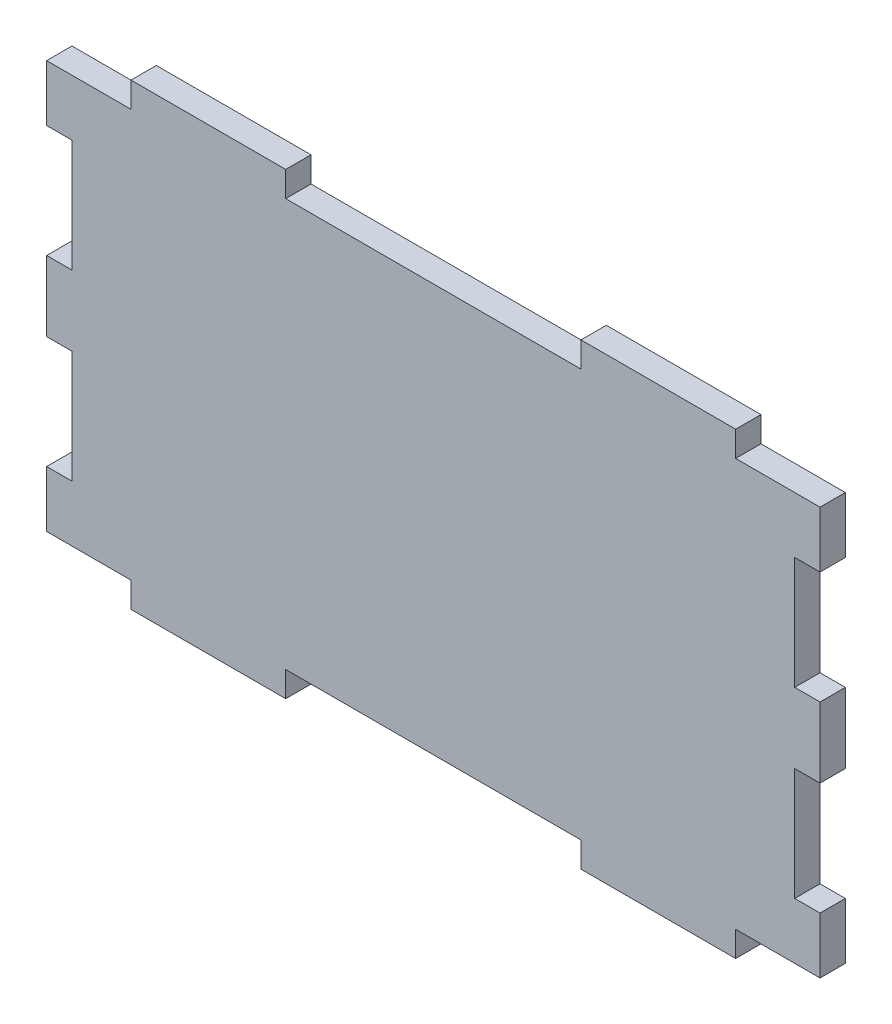
ISO-10303-21;
HEADER;
FILE_DESCRIPTION(('STEP AP214'),'2;1');
FILE_NAME('part.step','',(''),(''),'','','');
FILE_SCHEMA(('AUTOMOTIVE_DESIGN { 1 0 10303 214 1 1 1 1 }'));
ENDSEC;
DATA;
#1=APPLICATION_CONTEXT('core data for automotive mechanical design processes');
#2=APPLICATION_PROTOCOL_DEFINITION('international standard','automotive_design',2000,#1);
#3=PRODUCT_CONTEXT('',#1,'mechanical');
#4=PRODUCT('Part','Part','',(#3));
#5=PRODUCT_RELATED_PRODUCT_CATEGORY('part','',(#4));
#6=PRODUCT_DEFINITION_FORMATION('','',#4);
#7=PRODUCT_DEFINITION_CONTEXT('part definition',#1,'design');
#8=PRODUCT_DEFINITION('design','',#6,#7);
#9=PRODUCT_DEFINITION_SHAPE('','',#8);
#10=(LENGTH_UNIT() NAMED_UNIT(*) SI_UNIT(.MILLI.,.METRE.));
#11=(NAMED_UNIT(*) PLANE_ANGLE_UNIT() SI_UNIT($,.RADIAN.));
#12=(NAMED_UNIT(*) SI_UNIT($,.STERADIAN.) SOLID_ANGLE_UNIT());
#13=UNCERTAINTY_MEASURE_WITH_UNIT(LENGTH_MEASURE(1.E-05),#10,'distance_accuracy_value','');
#14=(GEOMETRIC_REPRESENTATION_CONTEXT(3) GLOBAL_UNCERTAINTY_ASSIGNED_CONTEXT((#13)) GLOBAL_UNIT_ASSIGNED_CONTEXT((#10,
#11,#12)) REPRESENTATION_CONTEXT('',''));
#15=CARTESIAN_POINT('',(0.,0.,0.));
#16=DIRECTION('',(0.,0.,1.));
#17=DIRECTION('',(1.,0.,0.));
#18=AXIS2_PLACEMENT_3D('',#15,#16,#17);
#19=CARTESIAN_POINT('',(0.,0.,-3.6));
#20=DIRECTION('',(0.,-1.,0.));
#21=DIRECTION('',(0.,0.,-1.));
#22=AXIS2_PLACEMENT_3D('',#19,#20,#21);
#23=PLANE('',#22);
#24=DIRECTION('',(0.,0.,1.));
#25=VECTOR('',#24,1.);
#26=CARTESIAN_POINT('',(98.,0.,-25.8925996689484));
#27=LINE('',#26,#25);
#28=CARTESIAN_POINT('',(98.,0.,-3.6));
#29=VERTEX_POINT('',#28);
#30=CARTESIAN_POINT('',(98.,0.,0.));
#31=VERTEX_POINT('',#30);
#32=EDGE_CURVE('E284',#29,#31,#27,.T.);
#33=ORIENTED_EDGE('',*,*,#32,.F.);
#34=DIRECTION('',(1.,0.,0.));
#35=VECTOR('',#34,1.);
#36=CARTESIAN_POINT('',(0.,0.,-3.6));
#37=LINE('',#36,#35);
#38=CARTESIAN_POINT('',(110.,0.,-3.6));
#39=VERTEX_POINT('',#38);
#40=EDGE_CURVE('E281',#29,#39,#37,.T.);
#41=ORIENTED_EDGE('',*,*,#40,.T.);
#42=DIRECTION('',(0.,0.,1.));
#43=VECTOR('',#42,1.);
#44=CARTESIAN_POINT('',(110.,0.,-3.6));
#45=LINE('',#44,#43);
#46=CARTESIAN_POINT('',(110.,0.,0.));
#47=VERTEX_POINT('',#46);
#48=EDGE_CURVE('E521',#39,#47,#45,.T.);
#49=ORIENTED_EDGE('',*,*,#48,.T.);
#50=DIRECTION('',(1.,0.,0.));
#51=VECTOR('',#50,1.);
#52=CARTESIAN_POINT('',(0.,0.,0.));
#53=LINE('',#52,#51);
#54=EDGE_CURVE('E504',#31,#47,#53,.T.);
#55=ORIENTED_EDGE('',*,*,#54,.F.);
#56=EDGE_LOOP('',(#33,#41,#49,#55));
#57=FACE_BOUND('',#56,.T.);
#58=ADVANCED_FACE('F37',(#57),#23,.T.);
#59=CARTESIAN_POINT('',(0.,0.,-3.6));
#60=VERTEX_POINT('',#59);
#61=CARTESIAN_POINT('',(12.,0.,-3.6));
#62=VERTEX_POINT('',#61);
#63=EDGE_CURVE('E487',#60,#62,#37,.T.);
#64=ORIENTED_EDGE('',*,*,#63,.T.);
#65=DIRECTION('',(0.,0.,1.));
#66=VECTOR('',#65,1.);
#67=CARTESIAN_POINT('',(12.,0.,-25.8925996689484));
#68=LINE('',#67,#66);
#69=CARTESIAN_POINT('',(12.,0.,0.));
#70=VERTEX_POINT('',#69);
#71=EDGE_CURVE('E323',#62,#70,#68,.T.);
#72=ORIENTED_EDGE('',*,*,#71,.T.);
#73=CARTESIAN_POINT('',(0.,0.,0.));
#74=VERTEX_POINT('',#73);
#75=EDGE_CURVE('E506',#74,#70,#53,.T.);
#76=ORIENTED_EDGE('',*,*,#75,.F.);
#77=DIRECTION('',(0.,0.,1.));
#78=VECTOR('',#77,1.);
#79=CARTESIAN_POINT('',(0.,0.,-3.6));
#80=LINE('',#79,#78);
#81=EDGE_CURVE('E41',#60,#74,#80,.T.);
#82=ORIENTED_EDGE('',*,*,#81,.F.);
#83=EDGE_LOOP('',(#64,#72,#76,#82));
#84=FACE_BOUND('',#83,.T.);
#85=ADVANCED_FACE('F535',(#84),#23,.T.);
#86=CARTESIAN_POINT('',(0.,58.,-3.6));
#87=DIRECTION('',(0.,1.,0.));
#88=DIRECTION('',(0.,0.,1.));
#89=AXIS2_PLACEMENT_3D('',#86,#87,#88);
#90=PLANE('',#89);
#91=DIRECTION('',(0.,0.,1.));
#92=VECTOR('',#91,1.);
#93=CARTESIAN_POINT('',(98.,58.,-25.8925996689484));
#94=LINE('',#93,#92);
#95=CARTESIAN_POINT('',(98.,58.,-3.6));
#96=VERTEX_POINT('',#95);
#97=CARTESIAN_POINT('',(98.,58.,0.));
#98=VERTEX_POINT('',#97);
#99=EDGE_CURVE('E335',#96,#98,#94,.T.);
#100=ORIENTED_EDGE('',*,*,#99,.T.);
#101=DIRECTION('',(-1.,0.,0.));
#102=VECTOR('',#101,1.);
#103=CARTESIAN_POINT('',(0.,58.,0.));
#104=LINE('',#103,#102);
#105=CARTESIAN_POINT('',(110.,58.,0.));
#106=VERTEX_POINT('',#105);
#107=EDGE_CURVE('E516',#106,#98,#104,.T.);
#108=ORIENTED_EDGE('',*,*,#107,.F.);
#109=DIRECTION('',(0.,0.,1.));
#110=VECTOR('',#109,1.);
#111=CARTESIAN_POINT('',(110.,58.,-3.6));
#112=LINE('',#111,#110);
#113=CARTESIAN_POINT('',(110.,58.,-3.6));
#114=VERTEX_POINT('',#113);
#115=EDGE_CURVE('E46',#114,#106,#112,.T.);
#116=ORIENTED_EDGE('',*,*,#115,.F.);
#117=DIRECTION('',(-1.,0.,0.));
#118=VECTOR('',#117,1.);
#119=CARTESIAN_POINT('',(0.,58.,-3.6));
#120=LINE('',#119,#118);
#121=EDGE_CURVE('E497',#114,#96,#120,.T.);
#122=ORIENTED_EDGE('',*,*,#121,.T.);
#123=EDGE_LOOP('',(#100,#108,#116,#122));
#124=FACE_BOUND('',#123,.T.);
#125=ADVANCED_FACE('F579',(#124),#90,.T.);
#126=DIRECTION('',(0.,0.,1.));
#127=VECTOR('',#126,1.);
#128=CARTESIAN_POINT('',(76.,58.,-25.8925996689484));
#129=LINE('',#128,#127);
#130=CARTESIAN_POINT('',(76.,58.,-3.6));
#131=VERTEX_POINT('',#130);
#132=CARTESIAN_POINT('',(76.,58.,0.));
#133=VERTEX_POINT('',#132);
#134=EDGE_CURVE('E342',#131,#133,#129,.T.);
#135=ORIENTED_EDGE('',*,*,#134,.F.);
#136=CARTESIAN_POINT('',(34.,58.,-3.6));
#137=VERTEX_POINT('',#136);
#138=EDGE_CURVE('E500',#131,#137,#120,.T.);
#139=ORIENTED_EDGE('',*,*,#138,.T.);
#140=DIRECTION('',(0.,0.,1.));
#141=VECTOR('',#140,1.);
#142=CARTESIAN_POINT('',(34.,58.,-25.8925996689484));
#143=LINE('',#142,#141);
#144=CARTESIAN_POINT('',(34.,58.,0.));
#145=VERTEX_POINT('',#144);
#146=EDGE_CURVE('E361',#137,#145,#143,.T.);
#147=ORIENTED_EDGE('',*,*,#146,.T.);
#148=EDGE_CURVE('E518',#133,#145,#104,.T.);
#149=ORIENTED_EDGE('',*,*,#148,.F.);
#150=EDGE_LOOP('',(#135,#139,#147,#149));
#151=FACE_BOUND('',#150,.T.);
#152=ADVANCED_FACE('F659',(#151),#90,.T.);
#153=CARTESIAN_POINT('',(0.,0.,-3.6));
#154=DIRECTION('',(-1.,0.,0.));
#155=DIRECTION('',(0.,0.,1.));
#156=AXIS2_PLACEMENT_3D('',#153,#154,#155);
#157=PLANE('',#156);
#158=DIRECTION('',(0.,0.,-1.));
#159=VECTOR('',#158,1.);
#160=CARTESIAN_POINT('',(0.,24.,0.00100000000000013));
#161=LINE('',#160,#159);
#162=CARTESIAN_POINT('',(0.,24.,0.));
#163=VERTEX_POINT('',#162);
#164=CARTESIAN_POINT('',(0.,24.,-3.6));
#165=VERTEX_POINT('',#164);
#166=EDGE_CURVE('E424',#163,#165,#161,.T.);
#167=ORIENTED_EDGE('',*,*,#166,.F.);
#168=DIRECTION('',(0.,-1.,0.));
#169=VECTOR('',#168,1.);
#170=CARTESIAN_POINT('',(0.,0.,0.));
#171=LINE('',#170,#169);
#172=CARTESIAN_POINT('',(0.,34.,0.));
#173=VERTEX_POINT('',#172);
#174=EDGE_CURVE('E505',#173,#163,#171,.T.);
#175=ORIENTED_EDGE('',*,*,#174,.F.);
#176=DIRECTION('',(0.,0.,-1.));
#177=VECTOR('',#176,1.);
#178=CARTESIAN_POINT('',(0.,34.,0.00100000000000013));
#179=LINE('',#178,#177);
#180=CARTESIAN_POINT('',(0.,34.,-3.6));
#181=VERTEX_POINT('',#180);
#182=EDGE_CURVE('E448',#173,#181,#179,.T.);
#183=ORIENTED_EDGE('',*,*,#182,.T.);
#184=DIRECTION('',(0.,-1.,0.));
#185=VECTOR('',#184,1.);
#186=CARTESIAN_POINT('',(0.,0.,-3.6));
#187=LINE('',#186,#185);
#188=EDGE_CURVE('E485',#181,#165,#187,.T.);
#189=ORIENTED_EDGE('',*,*,#188,.T.);
#190=EDGE_LOOP('',(#167,#175,#183,#189));
#191=FACE_BOUND('',#190,.T.);
#192=ADVANCED_FACE('F547',(#191),#157,.T.);
#193=DIRECTION('',(0.,0.,-1.));
#194=VECTOR('',#193,1.);
#195=CARTESIAN_POINT('',(0.,50.,0.00100000000000013));
#196=LINE('',#195,#194);
#197=CARTESIAN_POINT('',(0.,50.,0.));
#198=VERTEX_POINT('',#197);
#199=CARTESIAN_POINT('',(0.,50.,-3.6));
#200=VERTEX_POINT('',#199);
#201=EDGE_CURVE('E446',#198,#200,#196,.T.);
#202=ORIENTED_EDGE('',*,*,#201,.F.);
#203=CARTESIAN_POINT('',(0.,58.,0.));
#204=VERTEX_POINT('',#203);
#205=EDGE_CURVE('E501',#204,#198,#171,.T.);
#206=ORIENTED_EDGE('',*,*,#205,.F.);
#207=DIRECTION('',(0.,0.,1.));
#208=VECTOR('',#207,1.);
#209=CARTESIAN_POINT('',(0.,58.,-3.6));
#210=LINE('',#209,#208);
#211=CARTESIAN_POINT('',(0.,58.,-3.6));
#212=VERTEX_POINT('',#211);
#213=EDGE_CURVE('E11',#212,#204,#210,.T.);
#214=ORIENTED_EDGE('',*,*,#213,.F.);
#215=EDGE_CURVE('E482',#212,#200,#187,.T.);
#216=ORIENTED_EDGE('',*,*,#215,.T.);
#217=EDGE_LOOP('',(#202,#206,#214,#216));
#218=FACE_BOUND('',#217,.T.);
#219=ADVANCED_FACE('F663',(#218),#157,.T.);
#220=CARTESIAN_POINT('',(110.,0.,-3.6));
#221=DIRECTION('',(1.,0.,0.));
#222=DIRECTION('',(0.,0.,-1.));
#223=AXIS2_PLACEMENT_3D('',#220,#221,#222);
#224=PLANE('',#223);
#225=DIRECTION('',(0.,0.,-1.));
#226=VECTOR('',#225,1.);
#227=CARTESIAN_POINT('',(110.,24.,0.00100000000000013));
#228=LINE('',#227,#226);
#229=CARTESIAN_POINT('',(110.,24.,0.));
#230=VERTEX_POINT('',#229);
#231=CARTESIAN_POINT('',(110.,24.,-3.6));
#232=VERTEX_POINT('',#231);
#233=EDGE_CURVE('E399',#230,#232,#228,.T.);
#234=ORIENTED_EDGE('',*,*,#233,.T.);
#235=DIRECTION('',(0.,1.,0.));
#236=VECTOR('',#235,1.);
#237=CARTESIAN_POINT('',(110.,0.,-3.6));
#238=LINE('',#237,#236);
#239=CARTESIAN_POINT('',(110.,34.,-3.6));
#240=VERTEX_POINT('',#239);
#241=EDGE_CURVE('E496',#232,#240,#238,.T.);
#242=ORIENTED_EDGE('',*,*,#241,.T.);
#243=DIRECTION('',(0.,0.,-1.));
#244=VECTOR('',#243,1.);
#245=CARTESIAN_POINT('',(110.,34.,0.00100000000000013));
#246=LINE('',#245,#244);
#247=CARTESIAN_POINT('',(110.,34.,0.));
#248=VERTEX_POINT('',#247);
#249=EDGE_CURVE('E468',#248,#240,#246,.T.);
#250=ORIENTED_EDGE('',*,*,#249,.F.);
#251=DIRECTION('',(0.,1.,0.));
#252=VECTOR('',#251,1.);
#253=CARTESIAN_POINT('',(110.,0.,0.));
#254=LINE('',#253,#252);
#255=EDGE_CURVE('E515',#230,#248,#254,.T.);
#256=ORIENTED_EDGE('',*,*,#255,.F.);
#257=EDGE_LOOP('',(#234,#242,#250,#256));
#258=FACE_BOUND('',#257,.T.);
#259=ADVANCED_FACE('F591',(#258),#224,.T.);
#260=DIRECTION('',(0.,0.,-1.));
#261=VECTOR('',#260,1.);
#262=CARTESIAN_POINT('',(110.,50.,0.00100000000000013));
#263=LINE('',#262,#261);
#264=CARTESIAN_POINT('',(110.,50.,0.));
#265=VERTEX_POINT('',#264);
#266=CARTESIAN_POINT('',(110.,50.,-3.6));
#267=VERTEX_POINT('',#266);
#268=EDGE_CURVE('E469',#265,#267,#263,.T.);
#269=ORIENTED_EDGE('',*,*,#268,.T.);
#270=EDGE_CURVE('E490',#267,#114,#238,.T.);
#271=ORIENTED_EDGE('',*,*,#270,.T.);
#272=ORIENTED_EDGE('',*,*,#115,.T.);
#273=EDGE_CURVE('E509',#265,#106,#254,.T.);
#274=ORIENTED_EDGE('',*,*,#273,.F.);
#275=EDGE_LOOP('',(#269,#271,#272,#274));
#276=FACE_BOUND('',#275,.T.);
#277=ADVANCED_FACE('F592',(#276),#224,.T.);
#278=DIRECTION('',(0.,0.,-1.));
#279=VECTOR('',#278,1.);
#280=CARTESIAN_POINT('',(0.,8.00000000000003,0.00100000000000013));
#281=LINE('',#280,#279);
#282=CARTESIAN_POINT('',(0.,8.00000000000003,0.));
#283=VERTEX_POINT('',#282);
#284=CARTESIAN_POINT('',(0.,8.00000000000003,-3.6));
#285=VERTEX_POINT('',#284);
#286=EDGE_CURVE('E426',#283,#285,#281,.T.);
#287=ORIENTED_EDGE('',*,*,#286,.T.);
#288=EDGE_CURVE('E486',#285,#60,#187,.T.);
#289=ORIENTED_EDGE('',*,*,#288,.T.);
#290=ORIENTED_EDGE('',*,*,#81,.T.);
#291=EDGE_CURVE('E481',#283,#74,#171,.T.);
#292=ORIENTED_EDGE('',*,*,#291,.F.);
#293=EDGE_LOOP('',(#287,#289,#290,#292));
#294=FACE_BOUND('',#293,.T.);
#295=ADVANCED_FACE('F39',(#294),#157,.T.);
#296=DIRECTION('',(0.,0.,1.));
#297=VECTOR('',#296,1.);
#298=CARTESIAN_POINT('',(12.,58.,-25.8925996689484));
#299=LINE('',#298,#297);
#300=CARTESIAN_POINT('',(12.,58.,-3.6));
#301=VERTEX_POINT('',#300);
#302=CARTESIAN_POINT('',(12.,58.,0.));
#303=VERTEX_POINT('',#302);
#304=EDGE_CURVE('E369',#301,#303,#299,.T.);
#305=ORIENTED_EDGE('',*,*,#304,.F.);
#306=EDGE_CURVE('E495',#301,#212,#120,.T.);
#307=ORIENTED_EDGE('',*,*,#306,.T.);
#308=ORIENTED_EDGE('',*,*,#213,.T.);
#309=EDGE_CURVE('E514',#303,#204,#104,.T.);
#310=ORIENTED_EDGE('',*,*,#309,.F.);
#311=EDGE_LOOP('',(#305,#307,#308,#310));
#312=FACE_BOUND('',#311,.T.);
#313=ADVANCED_FACE('F589',(#312),#90,.T.);
#314=DIRECTION('',(0.,0.,-1.));
#315=VECTOR('',#314,1.);
#316=CARTESIAN_POINT('',(110.,8.,0.00100000000000013));
#317=LINE('',#316,#315);
#318=CARTESIAN_POINT('',(110.,8.,0.));
#319=VERTEX_POINT('',#318);
#320=CARTESIAN_POINT('',(110.,8.,-3.6));
#321=VERTEX_POINT('',#320);
#322=EDGE_CURVE('E398',#319,#321,#317,.T.);
#323=ORIENTED_EDGE('',*,*,#322,.F.);
#324=EDGE_CURVE('E511',#47,#319,#254,.T.);
#325=ORIENTED_EDGE('',*,*,#324,.F.);
#326=ORIENTED_EDGE('',*,*,#48,.F.);
#327=EDGE_CURVE('E492',#39,#321,#238,.T.);
#328=ORIENTED_EDGE('',*,*,#327,.T.);
#329=EDGE_LOOP('',(#323,#325,#326,#328));
#330=FACE_BOUND('',#329,.T.);
#331=ADVANCED_FACE('F582',(#330),#224,.T.);
#332=DIRECTION('',(0.,0.,1.));
#333=VECTOR('',#332,1.);
#334=CARTESIAN_POINT('',(76.,0.,-25.8925996689484));
#335=LINE('',#334,#333);
#336=CARTESIAN_POINT('',(76.,0.,-3.6));
#337=VERTEX_POINT('',#336);
#338=CARTESIAN_POINT('',(76.,0.,0.));
#339=VERTEX_POINT('',#338);
#340=EDGE_CURVE('E302',#337,#339,#335,.T.);
#341=ORIENTED_EDGE('',*,*,#340,.T.);
#342=CARTESIAN_POINT('',(34.,0.,0.));
#343=VERTEX_POINT('',#342);
#344=EDGE_CURVE('E510',#343,#339,#53,.T.);
#345=ORIENTED_EDGE('',*,*,#344,.F.);
#346=DIRECTION('',(0.,0.,1.));
#347=VECTOR('',#346,1.);
#348=CARTESIAN_POINT('',(34.,0.,-25.8925996689484));
#349=LINE('',#348,#347);
#350=CARTESIAN_POINT('',(34.,0.,-3.6));
#351=VERTEX_POINT('',#350);
#352=EDGE_CURVE('E326',#351,#343,#349,.T.);
#353=ORIENTED_EDGE('',*,*,#352,.F.);
#354=EDGE_CURVE('E491',#351,#337,#37,.T.);
#355=ORIENTED_EDGE('',*,*,#354,.T.);
#356=EDGE_LOOP('',(#341,#345,#353,#355));
#357=FACE_BOUND('',#356,.T.);
#358=ADVANCED_FACE('F575',(#357),#23,.T.);
#359=CARTESIAN_POINT('',(0.,0.,-3.6));
#360=DIRECTION('',(0.,0.,-1.));
#361=DIRECTION('',(-1.,0.,0.));
#362=AXIS2_PLACEMENT_3D('',#359,#360,#361);
#363=PLANE('',#362);
#364=DIRECTION('',(1.,0.,0.));
#365=VECTOR('',#364,1.);
#366=CARTESIAN_POINT('',(110.,24.,-3.6));
#367=LINE('',#366,#365);
#368=CARTESIAN_POINT('',(106.4,24.,-3.6));
#369=VERTEX_POINT('',#368);
#370=EDGE_CURVE('E396',#369,#232,#367,.T.);
#371=ORIENTED_EDGE('',*,*,#370,.F.);
#372=DIRECTION('',(0.,1.,0.));
#373=VECTOR('',#372,1.);
#374=CARTESIAN_POINT('',(106.4,24.,-3.6));
#375=LINE('',#374,#373);
#376=CARTESIAN_POINT('',(106.4,8.,-3.6));
#377=VERTEX_POINT('',#376);
#378=EDGE_CURVE('E393',#377,#369,#375,.T.);
#379=ORIENTED_EDGE('',*,*,#378,.F.);
#380=DIRECTION('',(-1.,0.,0.));
#381=VECTOR('',#380,1.);
#382=CARTESIAN_POINT('',(110.,8.,-3.6));
#383=LINE('',#382,#381);
#384=EDGE_CURVE('E390',#321,#377,#383,.T.);
#385=ORIENTED_EDGE('',*,*,#384,.F.);
#386=ORIENTED_EDGE('',*,*,#327,.F.);
#387=ORIENTED_EDGE('',*,*,#40,.F.);
#388=DIRECTION('',(0.,1.,0.));
#389=VECTOR('',#388,1.);
#390=CARTESIAN_POINT('',(98.,0.,-3.6));
#391=LINE('',#390,#389);
#392=CARTESIAN_POINT('',(98.,-3.6,-3.6));
#393=VERTEX_POINT('',#392);
#394=EDGE_CURVE('E273',#393,#29,#391,.T.);
#395=ORIENTED_EDGE('',*,*,#394,.F.);
#396=DIRECTION('',(1.,0.,0.));
#397=VECTOR('',#396,1.);
#398=CARTESIAN_POINT('',(76.,-3.6,-3.6));
#399=LINE('',#398,#397);
#400=CARTESIAN_POINT('',(76.,-3.6,-3.6));
#401=VERTEX_POINT('',#400);
#402=EDGE_CURVE('E278',#401,#393,#399,.T.);
#403=ORIENTED_EDGE('',*,*,#402,.F.);
#404=DIRECTION('',(0.,-1.,0.));
#405=VECTOR('',#404,1.);
#406=CARTESIAN_POINT('',(76.,0.,-3.6));
#407=LINE('',#406,#405);
#408=EDGE_CURVE('E301',#337,#401,#407,.T.);
#409=ORIENTED_EDGE('',*,*,#408,.F.);
#410=ORIENTED_EDGE('',*,*,#354,.F.);
#411=DIRECTION('',(0.,1.,0.));
#412=VECTOR('',#411,1.);
#413=CARTESIAN_POINT('',(34.,0.,-3.6));
#414=LINE('',#413,#412);
#415=CARTESIAN_POINT('',(34.,-3.6,-3.6));
#416=VERTEX_POINT('',#415);
#417=EDGE_CURVE('E324',#416,#351,#414,.T.);
#418=ORIENTED_EDGE('',*,*,#417,.F.);
#419=DIRECTION('',(1.,0.,0.));
#420=VECTOR('',#419,1.);
#421=CARTESIAN_POINT('',(12.,-3.6,-3.6));
#422=LINE('',#421,#420);
#423=CARTESIAN_POINT('',(12.,-3.6,-3.6));
#424=VERTEX_POINT('',#423);
#425=EDGE_CURVE('E311',#424,#416,#422,.T.);
#426=ORIENTED_EDGE('',*,*,#425,.F.);
#427=DIRECTION('',(0.,-1.,0.));
#428=VECTOR('',#427,1.);
#429=CARTESIAN_POINT('',(12.,0.,-3.6));
#430=LINE('',#429,#428);
#431=EDGE_CURVE('E319',#62,#424,#430,.T.);
#432=ORIENTED_EDGE('',*,*,#431,.F.);
#433=ORIENTED_EDGE('',*,*,#63,.F.);
#434=ORIENTED_EDGE('',*,*,#288,.F.);
#435=DIRECTION('',(-1.,0.,0.));
#436=VECTOR('',#435,1.);
#437=CARTESIAN_POINT('',(0.,8.00000000000003,-3.6));
#438=LINE('',#437,#436);
#439=CARTESIAN_POINT('',(3.60000000000002,8.00000000000003,-3.6));
#440=VERTEX_POINT('',#439);
#441=EDGE_CURVE('E421',#440,#285,#438,.T.);
#442=ORIENTED_EDGE('',*,*,#441,.F.);
#443=DIRECTION('',(0.,-1.,0.));
#444=VECTOR('',#443,1.);
#445=CARTESIAN_POINT('',(3.60000000000001,24.,-3.6));
#446=LINE('',#445,#444);
#447=CARTESIAN_POINT('',(3.60000000000001,24.,-3.6));
#448=VERTEX_POINT('',#447);
#449=EDGE_CURVE('E418',#448,#440,#446,.T.);
#450=ORIENTED_EDGE('',*,*,#449,.F.);
#451=DIRECTION('',(1.,0.,0.));
#452=VECTOR('',#451,1.);
#453=CARTESIAN_POINT('',(0.,24.,-3.6));
#454=LINE('',#453,#452);
#455=EDGE_CURVE('E415',#165,#448,#454,.T.);
#456=ORIENTED_EDGE('',*,*,#455,.F.);
#457=ORIENTED_EDGE('',*,*,#188,.F.);
#458=DIRECTION('',(-1.,0.,0.));
#459=VECTOR('',#458,1.);
#460=CARTESIAN_POINT('',(0.,34.,-3.6));
#461=LINE('',#460,#459);
#462=CARTESIAN_POINT('',(3.60000000000001,34.,-3.6));
#463=VERTEX_POINT('',#462);
#464=EDGE_CURVE('E443',#463,#181,#461,.T.);
#465=ORIENTED_EDGE('',*,*,#464,.F.);
#466=DIRECTION('',(0.,-1.,0.));
#467=VECTOR('',#466,1.);
#468=CARTESIAN_POINT('',(3.60000000000001,50.,-3.6));
#469=LINE('',#468,#467);
#470=CARTESIAN_POINT('',(3.60000000000001,50.,-3.6));
#471=VERTEX_POINT('',#470);
#472=EDGE_CURVE('E440',#471,#463,#469,.T.);
#473=ORIENTED_EDGE('',*,*,#472,.F.);
#474=DIRECTION('',(1.,0.,0.));
#475=VECTOR('',#474,1.);
#476=CARTESIAN_POINT('',(0.,50.,-3.6));
#477=LINE('',#476,#475);
#478=EDGE_CURVE('E437',#200,#471,#477,.T.);
#479=ORIENTED_EDGE('',*,*,#478,.F.);
#480=ORIENTED_EDGE('',*,*,#215,.F.);
#481=ORIENTED_EDGE('',*,*,#306,.F.);
#482=DIRECTION('',(0.,-1.,0.));
#483=VECTOR('',#482,1.);
#484=CARTESIAN_POINT('',(12.,58.,-3.6));
#485=LINE('',#484,#483);
#486=CARTESIAN_POINT('',(12.,61.6,-3.6));
#487=VERTEX_POINT('',#486);
#488=EDGE_CURVE('E367',#487,#301,#485,.T.);
#489=ORIENTED_EDGE('',*,*,#488,.F.);
#490=DIRECTION('',(-1.,0.,0.));
#491=VECTOR('',#490,1.);
#492=CARTESIAN_POINT('',(12.,61.6,-3.6));
#493=LINE('',#492,#491);
#494=CARTESIAN_POINT('',(34.,61.6,-3.6));
#495=VERTEX_POINT('',#494);
#496=EDGE_CURVE('E371',#495,#487,#493,.T.);
#497=ORIENTED_EDGE('',*,*,#496,.F.);
#498=DIRECTION('',(0.,1.,0.));
#499=VECTOR('',#498,1.);
#500=CARTESIAN_POINT('',(34.,58.,-3.6));
#501=LINE('',#500,#499);
#502=EDGE_CURVE('E375',#137,#495,#501,.T.);
#503=ORIENTED_EDGE('',*,*,#502,.F.);
#504=ORIENTED_EDGE('',*,*,#138,.F.);
#505=DIRECTION('',(0.,-1.,0.));
#506=VECTOR('',#505,1.);
#507=CARTESIAN_POINT('',(76.,58.,-3.6));
#508=LINE('',#507,#506);
#509=CARTESIAN_POINT('',(76.,61.6,-3.6));
#510=VERTEX_POINT('',#509);
#511=EDGE_CURVE('E340',#510,#131,#508,.T.);
#512=ORIENTED_EDGE('',*,*,#511,.F.);
#513=DIRECTION('',(-1.,0.,0.));
#514=VECTOR('',#513,1.);
#515=CARTESIAN_POINT('',(76.,61.6,-3.6));
#516=LINE('',#515,#514);
#517=CARTESIAN_POINT('',(98.,61.6,-3.6));
#518=VERTEX_POINT('',#517);
#519=EDGE_CURVE('E344',#518,#510,#516,.T.);
#520=ORIENTED_EDGE('',*,*,#519,.F.);
#521=DIRECTION('',(0.,1.,0.));
#522=VECTOR('',#521,1.);
#523=CARTESIAN_POINT('',(98.,58.,-3.6));
#524=LINE('',#523,#522);
#525=EDGE_CURVE('E348',#96,#518,#524,.T.);
#526=ORIENTED_EDGE('',*,*,#525,.F.);
#527=ORIENTED_EDGE('',*,*,#121,.F.);
#528=ORIENTED_EDGE('',*,*,#270,.F.);
#529=DIRECTION('',(1.,0.,0.));
#530=VECTOR('',#529,1.);
#531=CARTESIAN_POINT('',(110.,50.,-3.6));
#532=LINE('',#531,#530);
#533=CARTESIAN_POINT('',(106.4,50.,-3.6));
#534=VERTEX_POINT('',#533);
#535=EDGE_CURVE('E466',#534,#267,#532,.T.);
#536=ORIENTED_EDGE('',*,*,#535,.F.);
#537=DIRECTION('',(0.,1.,0.));
#538=VECTOR('',#537,1.);
#539=CARTESIAN_POINT('',(106.4,50.,-3.6));
#540=LINE('',#539,#538);
#541=CARTESIAN_POINT('',(106.4,34.,-3.6));
#542=VERTEX_POINT('',#541);
#543=EDGE_CURVE('E463',#542,#534,#540,.T.);
#544=ORIENTED_EDGE('',*,*,#543,.F.);
#545=DIRECTION('',(-1.,0.,0.));
#546=VECTOR('',#545,1.);
#547=CARTESIAN_POINT('',(110.,34.,-3.6));
#548=LINE('',#547,#546);
#549=EDGE_CURVE('E460',#240,#542,#548,.T.);
#550=ORIENTED_EDGE('',*,*,#549,.F.);
#551=ORIENTED_EDGE('',*,*,#241,.F.);
#552=EDGE_LOOP('',(#371,#379,#385,#386,#387,#395,#403,#409,#410,#418,#426,#432,#433,#434,#442,
#450,#456,#457,#465,#473,#479,#480,#481,#489,#497,#503,#504,#512,#520,#526,#527,#528,#536,#544,
#550,#551));
#553=FACE_BOUND('',#552,.T.);
#554=ADVANCED_FACE('F276',(#553),#363,.T.);
#555=CARTESIAN_POINT('',(0.,0.,0.));
#556=DIRECTION('',(0.,0.,-1.));
#557=DIRECTION('',(-1.,0.,0.));
#558=AXIS2_PLACEMENT_3D('',#555,#556,#557);
#559=PLANE('',#558);
#560=DIRECTION('',(0.,-1.,0.));
#561=VECTOR('',#560,1.);
#562=CARTESIAN_POINT('',(106.4,24.,0.));
#563=LINE('',#562,#561);
#564=CARTESIAN_POINT('',(106.4,24.,0.));
#565=VERTEX_POINT('',#564);
#566=CARTESIAN_POINT('',(106.4,8.,0.));
#567=VERTEX_POINT('',#566);
#568=EDGE_CURVE('E384',#565,#567,#563,.T.);
#569=ORIENTED_EDGE('',*,*,#568,.F.);
#570=DIRECTION('',(-1.,0.,0.));
#571=VECTOR('',#570,1.);
#572=CARTESIAN_POINT('',(110.,24.,0.));
#573=LINE('',#572,#571);
#574=EDGE_CURVE('E386',#230,#565,#573,.T.);
#575=ORIENTED_EDGE('',*,*,#574,.F.);
#576=ORIENTED_EDGE('',*,*,#255,.T.);
#577=DIRECTION('',(1.,0.,0.));
#578=VECTOR('',#577,1.);
#579=CARTESIAN_POINT('',(110.,34.,0.));
#580=LINE('',#579,#578);
#581=CARTESIAN_POINT('',(106.4,34.,0.));
#582=VERTEX_POINT('',#581);
#583=EDGE_CURVE('E472',#582,#248,#580,.T.);
#584=ORIENTED_EDGE('',*,*,#583,.F.);
#585=DIRECTION('',(0.,-1.,0.));
#586=VECTOR('',#585,1.);
#587=CARTESIAN_POINT('',(106.4,50.,0.));
#588=LINE('',#587,#586);
#589=CARTESIAN_POINT('',(106.4,50.,0.));
#590=VERTEX_POINT('',#589);
#591=EDGE_CURVE('E409',#590,#582,#588,.T.);
#592=ORIENTED_EDGE('',*,*,#591,.F.);
#593=DIRECTION('',(-1.,0.,0.));
#594=VECTOR('',#593,1.);
#595=CARTESIAN_POINT('',(110.,50.,0.));
#596=LINE('',#595,#594);
#597=EDGE_CURVE('E457',#265,#590,#596,.T.);
#598=ORIENTED_EDGE('',*,*,#597,.F.);
#599=ORIENTED_EDGE('',*,*,#273,.T.);
#600=ORIENTED_EDGE('',*,*,#107,.T.);
#601=DIRECTION('',(0.,1.,0.));
#602=VECTOR('',#601,1.);
#603=CARTESIAN_POINT('',(98.,58.,0.));
#604=LINE('',#603,#602);
#605=CARTESIAN_POINT('',(98.,61.6,0.));
#606=VERTEX_POINT('',#605);
#607=EDGE_CURVE('E336',#98,#606,#604,.T.);
#608=ORIENTED_EDGE('',*,*,#607,.T.);
#609=DIRECTION('',(-1.,0.,0.));
#610=VECTOR('',#609,1.);
#611=CARTESIAN_POINT('',(76.,61.6,0.));
#612=LINE('',#611,#610);
#613=CARTESIAN_POINT('',(76.,61.6,0.));
#614=VERTEX_POINT('',#613);
#615=EDGE_CURVE('E332',#606,#614,#612,.T.);
#616=ORIENTED_EDGE('',*,*,#615,.T.);
#617=DIRECTION('',(0.,-1.,0.));
#618=VECTOR('',#617,1.);
#619=CARTESIAN_POINT('',(76.,58.,0.));
#620=LINE('',#619,#618);
#621=EDGE_CURVE('E331',#614,#133,#620,.T.);
#622=ORIENTED_EDGE('',*,*,#621,.T.);
#623=ORIENTED_EDGE('',*,*,#148,.T.);
#624=DIRECTION('',(0.,1.,0.));
#625=VECTOR('',#624,1.);
#626=CARTESIAN_POINT('',(34.,58.,0.));
#627=LINE('',#626,#625);
#628=CARTESIAN_POINT('',(34.,61.6,0.));
#629=VERTEX_POINT('',#628);
#630=EDGE_CURVE('E362',#145,#629,#627,.T.);
#631=ORIENTED_EDGE('',*,*,#630,.T.);
#632=DIRECTION('',(-1.,0.,0.));
#633=VECTOR('',#632,1.);
#634=CARTESIAN_POINT('',(12.,61.6,0.));
#635=LINE('',#634,#633);
#636=CARTESIAN_POINT('',(12.,61.6,0.));
#637=VERTEX_POINT('',#636);
#638=EDGE_CURVE('E358',#629,#637,#635,.T.);
#639=ORIENTED_EDGE('',*,*,#638,.T.);
#640=DIRECTION('',(0.,-1.,0.));
#641=VECTOR('',#640,1.);
#642=CARTESIAN_POINT('',(12.,58.,0.));
#643=LINE('',#642,#641);
#644=EDGE_CURVE('E357',#637,#303,#643,.T.);
#645=ORIENTED_EDGE('',*,*,#644,.T.);
#646=ORIENTED_EDGE('',*,*,#309,.T.);
#647=ORIENTED_EDGE('',*,*,#205,.T.);
#648=DIRECTION('',(-1.,0.,0.));
#649=VECTOR('',#648,1.);
#650=CARTESIAN_POINT('',(0.,50.,0.));
#651=LINE('',#650,#649);
#652=CARTESIAN_POINT('',(3.60000000000001,50.,0.));
#653=VERTEX_POINT('',#652);
#654=EDGE_CURVE('E435',#653,#198,#651,.T.);
#655=ORIENTED_EDGE('',*,*,#654,.F.);
#656=DIRECTION('',(0.,1.,0.));
#657=VECTOR('',#656,1.);
#658=CARTESIAN_POINT('',(3.60000000000001,50.,0.));
#659=LINE('',#658,#657);
#660=CARTESIAN_POINT('',(3.60000000000001,34.,0.));
#661=VERTEX_POINT('',#660);
#662=EDGE_CURVE('E413',#661,#653,#659,.T.);
#663=ORIENTED_EDGE('',*,*,#662,.F.);
#664=DIRECTION('',(1.,0.,0.));
#665=VECTOR('',#664,1.);
#666=CARTESIAN_POINT('',(0.,34.,0.));
#667=LINE('',#666,#665);
#668=EDGE_CURVE('E383',#173,#661,#667,.T.);
#669=ORIENTED_EDGE('',*,*,#668,.F.);
#670=ORIENTED_EDGE('',*,*,#174,.T.);
#671=DIRECTION('',(-1.,0.,0.));
#672=VECTOR('',#671,1.);
#673=CARTESIAN_POINT('',(0.,24.,0.));
#674=LINE('',#673,#672);
#675=CARTESIAN_POINT('',(3.60000000000001,24.,0.));
#676=VERTEX_POINT('',#675);
#677=EDGE_CURVE('E412',#676,#163,#674,.T.);
#678=ORIENTED_EDGE('',*,*,#677,.F.);
#679=DIRECTION('',(0.,1.,0.));
#680=VECTOR('',#679,1.);
#681=CARTESIAN_POINT('',(3.60000000000001,24.,0.));
#682=LINE('',#681,#680);
#683=CARTESIAN_POINT('',(3.60000000000002,8.00000000000003,0.));
#684=VERTEX_POINT('',#683);
#685=EDGE_CURVE('E387',#684,#676,#682,.T.);
#686=ORIENTED_EDGE('',*,*,#685,.F.);
#687=DIRECTION('',(1.,0.,0.));
#688=VECTOR('',#687,1.);
#689=CARTESIAN_POINT('',(0.,8.00000000000003,0.));
#690=LINE('',#689,#688);
#691=EDGE_CURVE('E410',#283,#684,#690,.T.);
#692=ORIENTED_EDGE('',*,*,#691,.F.);
#693=ORIENTED_EDGE('',*,*,#291,.T.);
#694=ORIENTED_EDGE('',*,*,#75,.T.);
#695=DIRECTION('',(0.,-1.,0.));
#696=VECTOR('',#695,1.);
#697=CARTESIAN_POINT('',(12.,0.,0.));
#698=LINE('',#697,#696);
#699=CARTESIAN_POINT('',(12.,-3.6,0.));
#700=VERTEX_POINT('',#699);
#701=EDGE_CURVE('E62',#70,#700,#698,.T.);
#702=ORIENTED_EDGE('',*,*,#701,.T.);
#703=DIRECTION('',(1.,0.,0.));
#704=VECTOR('',#703,1.);
#705=CARTESIAN_POINT('',(12.,-3.6,0.));
#706=LINE('',#705,#704);
#707=CARTESIAN_POINT('',(34.,-3.6,0.));
#708=VERTEX_POINT('',#707);
#709=EDGE_CURVE('E312',#700,#708,#706,.T.);
#710=ORIENTED_EDGE('',*,*,#709,.T.);
#711=DIRECTION('',(0.,1.,0.));
#712=VECTOR('',#711,1.);
#713=CARTESIAN_POINT('',(34.,0.,0.));
#714=LINE('',#713,#712);
#715=EDGE_CURVE('E308',#708,#343,#714,.T.);
#716=ORIENTED_EDGE('',*,*,#715,.T.);
#717=ORIENTED_EDGE('',*,*,#344,.T.);
#718=DIRECTION('',(0.,-1.,0.));
#719=VECTOR('',#718,1.);
#720=CARTESIAN_POINT('',(76.,0.,0.));
#721=LINE('',#720,#719);
#722=CARTESIAN_POINT('',(76.,-3.6,0.));
#723=VERTEX_POINT('',#722);
#724=EDGE_CURVE('E299',#339,#723,#721,.T.);
#725=ORIENTED_EDGE('',*,*,#724,.T.);
#726=DIRECTION('',(1.,0.,0.));
#727=VECTOR('',#726,1.);
#728=CARTESIAN_POINT('',(76.,-3.6,0.));
#729=LINE('',#728,#727);
#730=CARTESIAN_POINT('',(98.,-3.6,0.));
#731=VERTEX_POINT('',#730);
#732=EDGE_CURVE('E295',#723,#731,#729,.T.);
#733=ORIENTED_EDGE('',*,*,#732,.T.);
#734=DIRECTION('',(0.,1.,0.));
#735=VECTOR('',#734,1.);
#736=CARTESIAN_POINT('',(98.,0.,0.));
#737=LINE('',#736,#735);
#738=EDGE_CURVE('E54',#731,#31,#737,.T.);
#739=ORIENTED_EDGE('',*,*,#738,.T.);
#740=ORIENTED_EDGE('',*,*,#54,.T.);
#741=ORIENTED_EDGE('',*,*,#324,.T.);
#742=DIRECTION('',(1.,0.,0.));
#743=VECTOR('',#742,1.);
#744=CARTESIAN_POINT('',(110.,8.,0.));
#745=LINE('',#744,#743);
#746=EDGE_CURVE('E402',#567,#319,#745,.T.);
#747=ORIENTED_EDGE('',*,*,#746,.F.);
#748=EDGE_LOOP('',(#569,#575,#576,#584,#592,#598,#599,#600,#608,#616,#622,#623,#631,#639,#645,
#646,#647,#655,#663,#669,#670,#678,#686,#692,#693,#694,#702,#710,#716,#717,#725,#733,#739,#740,
#741,#747));
#749=FACE_BOUND('',#748,.T.);
#750=ADVANCED_FACE('F537',(#749),#559,.F.);
#751=CARTESIAN_POINT('',(110.,50.,0.00100000000000013));
#752=DIRECTION('',(0.,1.,0.));
#753=DIRECTION('',(0.,0.,1.));
#754=AXIS2_PLACEMENT_3D('',#751,#752,#753);
#755=PLANE('',#754);
#756=ORIENTED_EDGE('',*,*,#597,.T.);
#757=DIRECTION('',(0.,0.,-1.));
#758=VECTOR('',#757,1.);
#759=CARTESIAN_POINT('',(106.4,50.,0.00100000000000013));
#760=LINE('',#759,#758);
#761=EDGE_CURVE('E473',#590,#534,#760,.T.);
#762=ORIENTED_EDGE('',*,*,#761,.T.);
#763=ORIENTED_EDGE('',*,*,#535,.T.);
#764=ORIENTED_EDGE('',*,*,#268,.F.);
#765=EDGE_LOOP('',(#756,#762,#763,#764));
#766=FACE_BOUND('',#765,.T.);
#767=ADVANCED_FACE('F642',(#766),#755,.F.);
#768=CARTESIAN_POINT('',(106.4,50.,0.00100000000000013));
#769=DIRECTION('',(-1.,0.,0.));
#770=DIRECTION('',(0.,0.,1.));
#771=AXIS2_PLACEMENT_3D('',#768,#769,#770);
#772=PLANE('',#771);
#773=ORIENTED_EDGE('',*,*,#591,.T.);
#774=DIRECTION('',(0.,0.,-1.));
#775=VECTOR('',#774,1.);
#776=CARTESIAN_POINT('',(106.4,34.,0.00100000000000013));
#777=LINE('',#776,#775);
#778=EDGE_CURVE('E475',#582,#542,#777,.T.);
#779=ORIENTED_EDGE('',*,*,#778,.T.);
#780=ORIENTED_EDGE('',*,*,#543,.T.);
#781=ORIENTED_EDGE('',*,*,#761,.F.);
#782=EDGE_LOOP('',(#773,#779,#780,#781));
#783=FACE_BOUND('',#782,.T.);
#784=ADVANCED_FACE('F640',(#783),#772,.F.);
#785=CARTESIAN_POINT('',(110.,34.,0.00100000000000013));
#786=DIRECTION('',(0.,-1.,0.));
#787=DIRECTION('',(0.,0.,-1.));
#788=AXIS2_PLACEMENT_3D('',#785,#786,#787);
#789=PLANE('',#788);
#790=ORIENTED_EDGE('',*,*,#583,.T.);
#791=ORIENTED_EDGE('',*,*,#249,.T.);
#792=ORIENTED_EDGE('',*,*,#549,.T.);
#793=ORIENTED_EDGE('',*,*,#778,.F.);
#794=EDGE_LOOP('',(#790,#791,#792,#793));
#795=FACE_BOUND('',#794,.T.);
#796=ADVANCED_FACE('F638',(#795),#789,.F.);
#797=CARTESIAN_POINT('',(0.,50.,0.00100000000000013));
#798=DIRECTION('',(0.,1.,0.));
#799=DIRECTION('',(0.,0.,1.));
#800=AXIS2_PLACEMENT_3D('',#797,#798,#799);
#801=PLANE('',#800);
#802=ORIENTED_EDGE('',*,*,#654,.T.);
#803=ORIENTED_EDGE('',*,*,#201,.T.);
#804=ORIENTED_EDGE('',*,*,#478,.T.);
#805=DIRECTION('',(0.,0.,-1.));
#806=VECTOR('',#805,1.);
#807=CARTESIAN_POINT('',(3.60000000000001,50.,0.00100000000000013));
#808=LINE('',#807,#806);
#809=EDGE_CURVE('E445',#653,#471,#808,.T.);
#810=ORIENTED_EDGE('',*,*,#809,.F.);
#811=EDGE_LOOP('',(#802,#803,#804,#810));
#812=FACE_BOUND('',#811,.T.);
#813=ADVANCED_FACE('F652',(#812),#801,.F.);
#814=CARTESIAN_POINT('',(0.,34.,0.00100000000000013));
#815=DIRECTION('',(0.,-1.,0.));
#816=DIRECTION('',(0.,0.,-1.));
#817=AXIS2_PLACEMENT_3D('',#814,#815,#816);
#818=PLANE('',#817);
#819=ORIENTED_EDGE('',*,*,#668,.T.);
#820=DIRECTION('',(0.,0.,-1.));
#821=VECTOR('',#820,1.);
#822=CARTESIAN_POINT('',(3.60000000000001,34.,0.00100000000000013));
#823=LINE('',#822,#821);
#824=EDGE_CURVE('E451',#661,#463,#823,.T.);
#825=ORIENTED_EDGE('',*,*,#824,.T.);
#826=ORIENTED_EDGE('',*,*,#464,.T.);
#827=ORIENTED_EDGE('',*,*,#182,.F.);
#828=EDGE_LOOP('',(#819,#825,#826,#827));
#829=FACE_BOUND('',#828,.T.);
#830=ADVANCED_FACE('F727',(#829),#818,.F.);
#831=CARTESIAN_POINT('',(3.60000000000001,50.,0.00100000000000013));
#832=DIRECTION('',(1.,0.,0.));
#833=DIRECTION('',(0.,0.,-1.));
#834=AXIS2_PLACEMENT_3D('',#831,#832,#833);
#835=PLANE('',#834);
#836=ORIENTED_EDGE('',*,*,#662,.T.);
#837=ORIENTED_EDGE('',*,*,#809,.T.);
#838=ORIENTED_EDGE('',*,*,#472,.T.);
#839=ORIENTED_EDGE('',*,*,#824,.F.);
#840=EDGE_LOOP('',(#836,#837,#838,#839));
#841=FACE_BOUND('',#840,.T.);
#842=ADVANCED_FACE('F726',(#841),#835,.F.);
#843=CARTESIAN_POINT('',(0.,24.,0.00100000000000013));
#844=DIRECTION('',(0.,1.,0.));
#845=DIRECTION('',(0.,0.,1.));
#846=AXIS2_PLACEMENT_3D('',#843,#844,#845);
#847=PLANE('',#846);
#848=ORIENTED_EDGE('',*,*,#677,.T.);
#849=ORIENTED_EDGE('',*,*,#166,.T.);
#850=ORIENTED_EDGE('',*,*,#455,.T.);
#851=DIRECTION('',(0.,0.,-1.));
#852=VECTOR('',#851,1.);
#853=CARTESIAN_POINT('',(3.60000000000001,24.,0.00100000000000013));
#854=LINE('',#853,#852);
#855=EDGE_CURVE('E423',#676,#448,#854,.T.);
#856=ORIENTED_EDGE('',*,*,#855,.F.);
#857=EDGE_LOOP('',(#848,#849,#850,#856));
#858=FACE_BOUND('',#857,.T.);
#859=ADVANCED_FACE('F552',(#858),#847,.F.);
#860=CARTESIAN_POINT('',(0.,8.00000000000003,0.00100000000000013));
#861=DIRECTION('',(0.,-1.,0.));
#862=DIRECTION('',(0.,0.,-1.));
#863=AXIS2_PLACEMENT_3D('',#860,#861,#862);
#864=PLANE('',#863);
#865=ORIENTED_EDGE('',*,*,#691,.T.);
#866=DIRECTION('',(0.,0.,-1.));
#867=VECTOR('',#866,1.);
#868=CARTESIAN_POINT('',(3.60000000000002,8.00000000000003,0.00100000000000013));
#869=LINE('',#868,#867);
#870=EDGE_CURVE('E429',#684,#440,#869,.T.);
#871=ORIENTED_EDGE('',*,*,#870,.T.);
#872=ORIENTED_EDGE('',*,*,#441,.T.);
#873=ORIENTED_EDGE('',*,*,#286,.F.);
#874=EDGE_LOOP('',(#865,#871,#872,#873));
#875=FACE_BOUND('',#874,.T.);
#876=ADVANCED_FACE('F560',(#875),#864,.F.);
#877=CARTESIAN_POINT('',(3.60000000000001,24.,0.00100000000000013));
#878=DIRECTION('',(1.,0.,0.));
#879=DIRECTION('',(0.,1.,0.));
#880=AXIS2_PLACEMENT_3D('',#877,#878,#879);
#881=PLANE('',#880);
#882=ORIENTED_EDGE('',*,*,#685,.T.);
#883=ORIENTED_EDGE('',*,*,#855,.T.);
#884=ORIENTED_EDGE('',*,*,#449,.T.);
#885=ORIENTED_EDGE('',*,*,#870,.F.);
#886=EDGE_LOOP('',(#882,#883,#884,#885));
#887=FACE_BOUND('',#886,.T.);
#888=ADVANCED_FACE('F558',(#887),#881,.F.);
#889=CARTESIAN_POINT('',(110.,24.,0.00100000000000013));
#890=DIRECTION('',(0.,1.,0.));
#891=DIRECTION('',(0.,0.,1.));
#892=AXIS2_PLACEMENT_3D('',#889,#890,#891);
#893=PLANE('',#892);
#894=ORIENTED_EDGE('',*,*,#574,.T.);
#895=DIRECTION('',(0.,0.,-1.));
#896=VECTOR('',#895,1.);
#897=CARTESIAN_POINT('',(106.4,24.,0.00100000000000013));
#898=LINE('',#897,#896);
#899=EDGE_CURVE('E403',#565,#369,#898,.T.);
#900=ORIENTED_EDGE('',*,*,#899,.T.);
#901=ORIENTED_EDGE('',*,*,#370,.T.);
#902=ORIENTED_EDGE('',*,*,#233,.F.);
#903=EDGE_LOOP('',(#894,#900,#901,#902));
#904=FACE_BOUND('',#903,.T.);
#905=ADVANCED_FACE('F614',(#904),#893,.F.);
#906=CARTESIAN_POINT('',(106.4,24.,0.00100000000000013));
#907=DIRECTION('',(-1.,0.,0.));
#908=DIRECTION('',(0.,-1.,0.));
#909=AXIS2_PLACEMENT_3D('',#906,#907,#908);
#910=PLANE('',#909);
#911=ORIENTED_EDGE('',*,*,#568,.T.);
#912=DIRECTION('',(0.,0.,-1.));
#913=VECTOR('',#912,1.);
#914=CARTESIAN_POINT('',(106.4,8.,0.00100000000000013));
#915=LINE('',#914,#913);
#916=EDGE_CURVE('E405',#567,#377,#915,.T.);
#917=ORIENTED_EDGE('',*,*,#916,.T.);
#918=ORIENTED_EDGE('',*,*,#378,.T.);
#919=ORIENTED_EDGE('',*,*,#899,.F.);
#920=EDGE_LOOP('',(#911,#917,#918,#919));
#921=FACE_BOUND('',#920,.T.);
#922=ADVANCED_FACE('F612',(#921),#910,.F.);
#923=CARTESIAN_POINT('',(110.,8.,0.00100000000000013));
#924=DIRECTION('',(0.,-1.,0.));
#925=DIRECTION('',(0.,0.,-1.));
#926=AXIS2_PLACEMENT_3D('',#923,#924,#925);
#927=PLANE('',#926);
#928=ORIENTED_EDGE('',*,*,#746,.T.);
#929=ORIENTED_EDGE('',*,*,#322,.T.);
#930=ORIENTED_EDGE('',*,*,#384,.T.);
#931=ORIENTED_EDGE('',*,*,#916,.F.);
#932=EDGE_LOOP('',(#928,#929,#930,#931));
#933=FACE_BOUND('',#932,.T.);
#934=ADVANCED_FACE('F608',(#933),#927,.F.);
#935=CARTESIAN_POINT('',(34.,58.,-25.8925996689484));
#936=DIRECTION('',(1.,0.,0.));
#937=DIRECTION('',(0.,0.,-1.));
#938=AXIS2_PLACEMENT_3D('',#935,#936,#937);
#939=PLANE('',#938);
#940=ORIENTED_EDGE('',*,*,#146,.F.);
#941=ORIENTED_EDGE('',*,*,#502,.T.);
#942=DIRECTION('',(0.,0.,1.));
#943=VECTOR('',#942,1.);
#944=CARTESIAN_POINT('',(34.,61.6,-25.8925996689484));
#945=LINE('',#944,#943);
#946=EDGE_CURVE('E374',#495,#629,#945,.T.);
#947=ORIENTED_EDGE('',*,*,#946,.T.);
#948=ORIENTED_EDGE('',*,*,#630,.F.);
#949=EDGE_LOOP('',(#940,#941,#947,#948));
#950=FACE_BOUND('',#949,.T.);
#951=ADVANCED_FACE('F694',(#950),#939,.T.);
#952=CARTESIAN_POINT('',(12.,61.6,-25.8925996689484));
#953=DIRECTION('',(0.,1.,0.));
#954=DIRECTION('',(0.,0.,1.));
#955=AXIS2_PLACEMENT_3D('',#952,#953,#954);
#956=PLANE('',#955);
#957=ORIENTED_EDGE('',*,*,#946,.F.);
#958=ORIENTED_EDGE('',*,*,#496,.T.);
#959=DIRECTION('',(0.,0.,1.));
#960=VECTOR('',#959,1.);
#961=CARTESIAN_POINT('',(12.,61.6,-25.8925996689484));
#962=LINE('',#961,#960);
#963=EDGE_CURVE('E370',#487,#637,#962,.T.);
#964=ORIENTED_EDGE('',*,*,#963,.T.);
#965=ORIENTED_EDGE('',*,*,#638,.F.);
#966=EDGE_LOOP('',(#957,#958,#964,#965));
#967=FACE_BOUND('',#966,.T.);
#968=ADVANCED_FACE('F697',(#967),#956,.T.);
#969=CARTESIAN_POINT('',(12.,58.,-25.8925996689484));
#970=DIRECTION('',(-1.,0.,0.));
#971=DIRECTION('',(0.,0.,1.));
#972=AXIS2_PLACEMENT_3D('',#969,#970,#971);
#973=PLANE('',#972);
#974=ORIENTED_EDGE('',*,*,#963,.F.);
#975=ORIENTED_EDGE('',*,*,#488,.T.);
#976=ORIENTED_EDGE('',*,*,#304,.T.);
#977=ORIENTED_EDGE('',*,*,#644,.F.);
#978=EDGE_LOOP('',(#974,#975,#976,#977));
#979=FACE_BOUND('',#978,.T.);
#980=ADVANCED_FACE('F700',(#979),#973,.T.);
#981=CARTESIAN_POINT('',(98.,58.,-25.8925996689484));
#982=DIRECTION('',(1.,0.,0.));
#983=DIRECTION('',(0.,0.,-1.));
#984=AXIS2_PLACEMENT_3D('',#981,#982,#983);
#985=PLANE('',#984);
#986=ORIENTED_EDGE('',*,*,#99,.F.);
#987=ORIENTED_EDGE('',*,*,#525,.T.);
#988=DIRECTION('',(0.,0.,1.));
#989=VECTOR('',#988,1.);
#990=CARTESIAN_POINT('',(98.,61.6,-25.8925996689484));
#991=LINE('',#990,#989);
#992=EDGE_CURVE('E347',#518,#606,#991,.T.);
#993=ORIENTED_EDGE('',*,*,#992,.T.);
#994=ORIENTED_EDGE('',*,*,#607,.F.);
#995=EDGE_LOOP('',(#986,#987,#993,#994));
#996=FACE_BOUND('',#995,.T.);
#997=ADVANCED_FACE('F631',(#996),#985,.T.);
#998=CARTESIAN_POINT('',(76.,61.6,-25.8925996689484));
#999=DIRECTION('',(0.,1.,0.));
#1000=DIRECTION('',(0.,0.,1.));
#1001=AXIS2_PLACEMENT_3D('',#998,#999,#1000);
#1002=PLANE('',#1001);
#1003=ORIENTED_EDGE('',*,*,#992,.F.);
#1004=ORIENTED_EDGE('',*,*,#519,.T.);
#1005=DIRECTION('',(0.,0.,1.));
#1006=VECTOR('',#1005,1.);
#1007=CARTESIAN_POINT('',(76.,61.6,-25.8925996689484));
#1008=LINE('',#1007,#1006);
#1009=EDGE_CURVE('E343',#510,#614,#1008,.T.);
#1010=ORIENTED_EDGE('',*,*,#1009,.T.);
#1011=ORIENTED_EDGE('',*,*,#615,.F.);
#1012=EDGE_LOOP('',(#1003,#1004,#1010,#1011));
#1013=FACE_BOUND('',#1012,.T.);
#1014=ADVANCED_FACE('F707',(#1013),#1002,.T.);
#1015=CARTESIAN_POINT('',(76.,58.,-25.8925996689484));
#1016=DIRECTION('',(-1.,0.,0.));
#1017=DIRECTION('',(0.,0.,1.));
#1018=AXIS2_PLACEMENT_3D('',#1015,#1016,#1017);
#1019=PLANE('',#1018);
#1020=ORIENTED_EDGE('',*,*,#1009,.F.);
#1021=ORIENTED_EDGE('',*,*,#511,.T.);
#1022=ORIENTED_EDGE('',*,*,#134,.T.);
#1023=ORIENTED_EDGE('',*,*,#621,.F.);
#1024=EDGE_LOOP('',(#1020,#1021,#1022,#1023));
#1025=FACE_BOUND('',#1024,.T.);
#1026=ADVANCED_FACE('F790',(#1025),#1019,.T.);
#1027=CARTESIAN_POINT('',(12.,-3.6,-25.8925996689484));
#1028=DIRECTION('',(0.,-1.,0.));
#1029=DIRECTION('',(0.,0.,-1.));
#1030=AXIS2_PLACEMENT_3D('',#1027,#1028,#1029);
#1031=PLANE('',#1030);
#1032=DIRECTION('',(0.,0.,1.));
#1033=VECTOR('',#1032,1.);
#1034=CARTESIAN_POINT('',(12.,-3.6,-25.8925996689484));
#1035=LINE('',#1034,#1033);
#1036=EDGE_CURVE('E322',#424,#700,#1035,.T.);
#1037=ORIENTED_EDGE('',*,*,#1036,.F.);
#1038=ORIENTED_EDGE('',*,*,#425,.T.);
#1039=DIRECTION('',(0.,0.,1.));
#1040=VECTOR('',#1039,1.);
#1041=CARTESIAN_POINT('',(34.,-3.6,-25.8925996689484));
#1042=LINE('',#1041,#1040);
#1043=EDGE_CURVE('E318',#416,#708,#1042,.T.);
#1044=ORIENTED_EDGE('',*,*,#1043,.T.);
#1045=ORIENTED_EDGE('',*,*,#709,.F.);
#1046=EDGE_LOOP('',(#1037,#1038,#1044,#1045));
#1047=FACE_BOUND('',#1046,.T.);
#1048=ADVANCED_FACE('F571',(#1047),#1031,.T.);
#1049=CARTESIAN_POINT('',(34.,0.,-25.8925996689484));
#1050=DIRECTION('',(1.,0.,0.));
#1051=DIRECTION('',(0.,0.,-1.));
#1052=AXIS2_PLACEMENT_3D('',#1049,#1050,#1051);
#1053=PLANE('',#1052);
#1054=ORIENTED_EDGE('',*,*,#1043,.F.);
#1055=ORIENTED_EDGE('',*,*,#417,.T.);
#1056=ORIENTED_EDGE('',*,*,#352,.T.);
#1057=ORIENTED_EDGE('',*,*,#715,.F.);
#1058=EDGE_LOOP('',(#1054,#1055,#1056,#1057));
#1059=FACE_BOUND('',#1058,.T.);
#1060=ADVANCED_FACE('F564',(#1059),#1053,.T.);
#1061=CARTESIAN_POINT('',(12.,0.,-25.8925996689484));
#1062=DIRECTION('',(-1.,0.,0.));
#1063=DIRECTION('',(0.,-1.,0.));
#1064=AXIS2_PLACEMENT_3D('',#1061,#1062,#1063);
#1065=PLANE('',#1064);
#1066=ORIENTED_EDGE('',*,*,#71,.F.);
#1067=ORIENTED_EDGE('',*,*,#431,.T.);
#1068=ORIENTED_EDGE('',*,*,#1036,.T.);
#1069=ORIENTED_EDGE('',*,*,#701,.F.);
#1070=EDGE_LOOP('',(#1066,#1067,#1068,#1069));
#1071=FACE_BOUND('',#1070,.T.);
#1072=ADVANCED_FACE('F562',(#1071),#1065,.T.);
#1073=CARTESIAN_POINT('',(76.,-3.6,-25.8925996689484));
#1074=DIRECTION('',(0.,-1.,0.));
#1075=DIRECTION('',(0.,0.,-1.));
#1076=AXIS2_PLACEMENT_3D('',#1073,#1074,#1075);
#1077=PLANE('',#1076);
#1078=DIRECTION('',(0.,0.,1.));
#1079=VECTOR('',#1078,1.);
#1080=CARTESIAN_POINT('',(76.,-3.6,-25.8925996689484));
#1081=LINE('',#1080,#1079);
#1082=EDGE_CURVE('E293',#401,#723,#1081,.T.);
#1083=ORIENTED_EDGE('',*,*,#1082,.F.);
#1084=ORIENTED_EDGE('',*,*,#402,.T.);
#1085=DIRECTION('',(0.,0.,1.));
#1086=VECTOR('',#1085,1.);
#1087=CARTESIAN_POINT('',(98.,-3.6,-25.8925996689484));
#1088=LINE('',#1087,#1086);
#1089=EDGE_CURVE('E285',#393,#731,#1088,.T.);
#1090=ORIENTED_EDGE('',*,*,#1089,.T.);
#1091=ORIENTED_EDGE('',*,*,#732,.F.);
#1092=EDGE_LOOP('',(#1083,#1084,#1090,#1091));
#1093=FACE_BOUND('',#1092,.T.);
#1094=ADVANCED_FACE('F292',(#1093),#1077,.T.);
#1095=CARTESIAN_POINT('',(98.,0.,-25.8925996689484));
#1096=DIRECTION('',(1.,0.,0.));
#1097=DIRECTION('',(0.,0.,-1.));
#1098=AXIS2_PLACEMENT_3D('',#1095,#1096,#1097);
#1099=PLANE('',#1098);
#1100=ORIENTED_EDGE('',*,*,#1089,.F.);
#1101=ORIENTED_EDGE('',*,*,#394,.T.);
#1102=ORIENTED_EDGE('',*,*,#32,.T.);
#1103=ORIENTED_EDGE('',*,*,#738,.F.);
#1104=EDGE_LOOP('',(#1100,#1101,#1102,#1103));
#1105=FACE_BOUND('',#1104,.T.);
#1106=ADVANCED_FACE('F287',(#1105),#1099,.T.);
#1107=CARTESIAN_POINT('',(76.,0.,-25.8925996689484));
#1108=DIRECTION('',(-1.,0.,0.));
#1109=DIRECTION('',(0.,0.,1.));
#1110=AXIS2_PLACEMENT_3D('',#1107,#1108,#1109);
#1111=PLANE('',#1110);
#1112=ORIENTED_EDGE('',*,*,#340,.F.);
#1113=ORIENTED_EDGE('',*,*,#408,.T.);
#1114=ORIENTED_EDGE('',*,*,#1082,.T.);
#1115=ORIENTED_EDGE('',*,*,#724,.F.);
#1116=EDGE_LOOP('',(#1112,#1113,#1114,#1115));
#1117=FACE_BOUND('',#1116,.T.);
#1118=ADVANCED_FACE('F832',(#1117),#1111,.T.);
#1119=CLOSED_SHELL('',(#58,#85,#125,#152,#192,#219,#259,#277,#295,#313,#331,#358,#554,#750,#767,
#784,#796,#813,#830,#842,#859,#876,#888,#905,#922,#934,#951,#968,#980,#997,#1014,#1026,#1048,
#1060,#1072,#1094,#1106,#1118));
#1120=MANIFOLD_SOLID_BREP('B2',#1119);
#1121=ADVANCED_BREP_SHAPE_REPRESENTATION('',(#18,#1120),#14);
#1122=SHAPE_DEFINITION_REPRESENTATION(#9,#1121);
ENDSEC;
END-ISO-10303-21;
